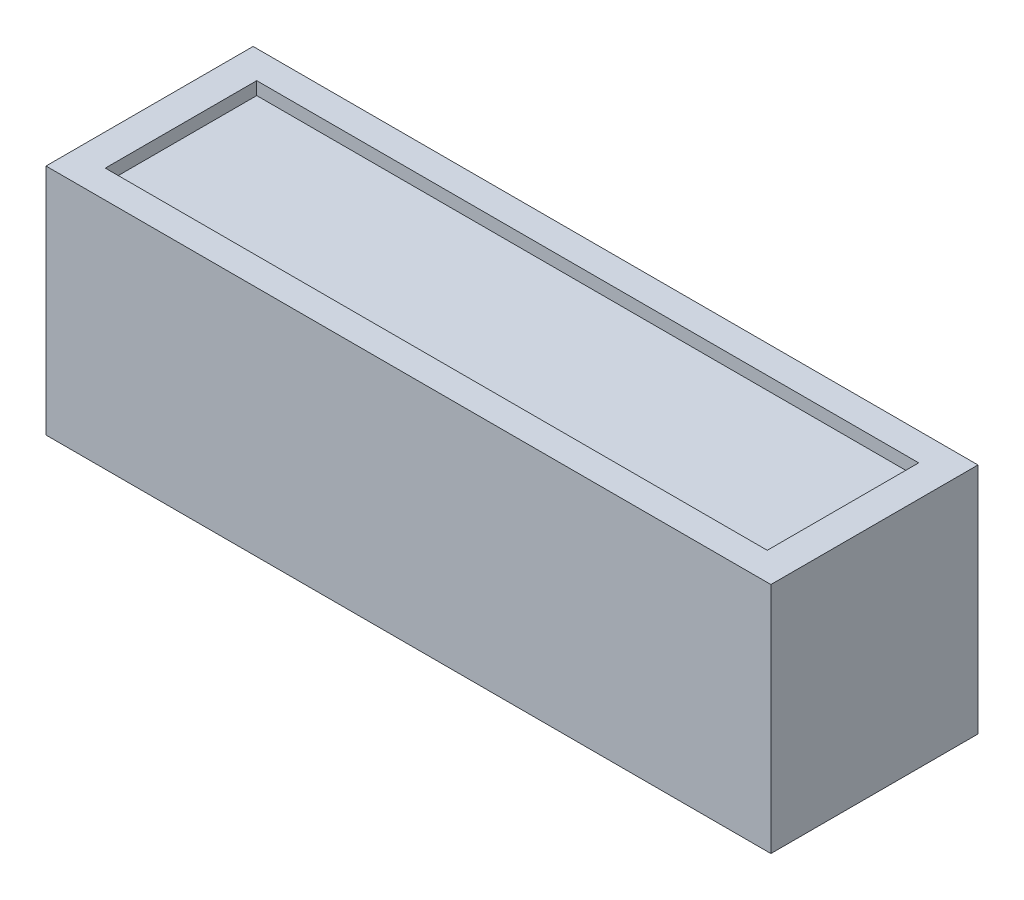
ISO-10303-21;
HEADER;
FILE_DESCRIPTION(('STEP AP214'),'2;1');
FILE_NAME('part.step','',(''),(''),'','','');
FILE_SCHEMA(('AUTOMOTIVE_DESIGN { 1 0 10303 214 1 1 1 1 }'));
ENDSEC;
DATA;
#1=APPLICATION_CONTEXT('core data for automotive mechanical design processes');
#2=APPLICATION_PROTOCOL_DEFINITION('international standard','automotive_design',2000,#1);
#3=PRODUCT_CONTEXT('',#1,'mechanical');
#4=PRODUCT('Part','Part','',(#3));
#5=PRODUCT_RELATED_PRODUCT_CATEGORY('part','',(#4));
#6=PRODUCT_DEFINITION_FORMATION('','',#4);
#7=PRODUCT_DEFINITION_CONTEXT('part definition',#1,'design');
#8=PRODUCT_DEFINITION('design','',#6,#7);
#9=PRODUCT_DEFINITION_SHAPE('','',#8);
#10=(LENGTH_UNIT() NAMED_UNIT(*) SI_UNIT(.MILLI.,.METRE.));
#11=(NAMED_UNIT(*) PLANE_ANGLE_UNIT() SI_UNIT($,.RADIAN.));
#12=(NAMED_UNIT(*) SI_UNIT($,.STERADIAN.) SOLID_ANGLE_UNIT());
#13=UNCERTAINTY_MEASURE_WITH_UNIT(LENGTH_MEASURE(1.E-05),#10,'distance_accuracy_value','');
#14=(GEOMETRIC_REPRESENTATION_CONTEXT(3) GLOBAL_UNCERTAINTY_ASSIGNED_CONTEXT((#13)) GLOBAL_UNIT_ASSIGNED_CONTEXT((#10,
#11,#12)) REPRESENTATION_CONTEXT('',''));
#15=CARTESIAN_POINT('',(0.,0.,0.));
#16=DIRECTION('',(0.,0.,1.));
#17=DIRECTION('',(1.,0.,0.));
#18=AXIS2_PLACEMENT_3D('',#15,#16,#17);
#19=CARTESIAN_POINT('',(0.,0.,8.));
#20=DIRECTION('',(1.,0.,0.));
#21=DIRECTION('',(0.,0.,-1.));
#22=AXIS2_PLACEMENT_3D('',#19,#20,#21);
#23=PLANE('',#22);
#24=DIRECTION('',(0.,-1.,0.));
#25=VECTOR('',#24,1.);
#26=CARTESIAN_POINT('',(0.,0.,0.));
#27=LINE('',#26,#25);
#28=CARTESIAN_POINT('',(0.,9.,0.));
#29=VERTEX_POINT('',#28);
#30=CARTESIAN_POINT('',(0.,0.,0.));
#31=VERTEX_POINT('',#30);
#32=EDGE_CURVE('E143',#29,#31,#27,.T.);
#33=ORIENTED_EDGE('',*,*,#32,.T.);
#34=DIRECTION('',(0.,0.,-1.));
#35=VECTOR('',#34,1.);
#36=CARTESIAN_POINT('',(0.,0.,8.));
#37=LINE('',#36,#35);
#38=CARTESIAN_POINT('',(0.,0.,8.));
#39=VERTEX_POINT('',#38);
#40=EDGE_CURVE('E11',#39,#31,#37,.T.);
#41=ORIENTED_EDGE('',*,*,#40,.F.);
#42=DIRECTION('',(0.,-1.,0.));
#43=VECTOR('',#42,1.);
#44=CARTESIAN_POINT('',(0.,0.,8.));
#45=LINE('',#44,#43);
#46=CARTESIAN_POINT('',(0.,9.,8.));
#47=VERTEX_POINT('',#46);
#48=EDGE_CURVE('E147',#47,#39,#45,.T.);
#49=ORIENTED_EDGE('',*,*,#48,.F.);
#50=DIRECTION('',(0.,0.,-1.));
#51=VECTOR('',#50,1.);
#52=CARTESIAN_POINT('',(0.,9.,8.));
#53=LINE('',#52,#51);
#54=EDGE_CURVE('E153',#47,#29,#53,.T.);
#55=ORIENTED_EDGE('',*,*,#54,.T.);
#56=EDGE_LOOP('',(#33,#41,#49,#55));
#57=FACE_BOUND('',#56,.T.);
#58=ADVANCED_FACE('F33',(#57),#23,.F.);
#59=CARTESIAN_POINT('',(0.,0.,8.));
#60=DIRECTION('',(0.,1.,0.));
#61=DIRECTION('',(0.,0.,1.));
#62=AXIS2_PLACEMENT_3D('',#59,#60,#61);
#63=PLANE('',#62);
#64=DIRECTION('',(1.,0.,0.));
#65=VECTOR('',#64,1.);
#66=CARTESIAN_POINT('',(0.,0.,0.));
#67=LINE('',#66,#65);
#68=CARTESIAN_POINT('',(28.,0.,0.));
#69=VERTEX_POINT('',#68);
#70=EDGE_CURVE('E156',#31,#69,#67,.T.);
#71=ORIENTED_EDGE('',*,*,#70,.T.);
#72=DIRECTION('',(0.,0.,-1.));
#73=VECTOR('',#72,1.);
#74=CARTESIAN_POINT('',(28.,0.,8.));
#75=LINE('',#74,#73);
#76=CARTESIAN_POINT('',(28.,0.,8.));
#77=VERTEX_POINT('',#76);
#78=EDGE_CURVE('E40',#77,#69,#75,.T.);
#79=ORIENTED_EDGE('',*,*,#78,.F.);
#80=DIRECTION('',(1.,0.,0.));
#81=VECTOR('',#80,1.);
#82=CARTESIAN_POINT('',(0.,0.,8.));
#83=LINE('',#82,#81);
#84=EDGE_CURVE('E84',#39,#77,#83,.T.);
#85=ORIENTED_EDGE('',*,*,#84,.F.);
#86=ORIENTED_EDGE('',*,*,#40,.T.);
#87=EDGE_LOOP('',(#71,#79,#85,#86));
#88=FACE_BOUND('',#87,.T.);
#89=ADVANCED_FACE('F185',(#88),#63,.F.);
#90=CARTESIAN_POINT('',(28.,0.,8.));
#91=DIRECTION('',(-1.,0.,0.));
#92=DIRECTION('',(0.,-1.,0.));
#93=AXIS2_PLACEMENT_3D('',#90,#91,#92);
#94=PLANE('',#93);
#95=DIRECTION('',(0.,1.,0.));
#96=VECTOR('',#95,1.);
#97=CARTESIAN_POINT('',(28.,0.,0.));
#98=LINE('',#97,#96);
#99=CARTESIAN_POINT('',(28.,9.,0.));
#100=VERTEX_POINT('',#99);
#101=EDGE_CURVE('E158',#69,#100,#98,.T.);
#102=ORIENTED_EDGE('',*,*,#101,.T.);
#103=DIRECTION('',(0.,0.,-1.));
#104=VECTOR('',#103,1.);
#105=CARTESIAN_POINT('',(28.,9.,8.));
#106=LINE('',#105,#104);
#107=CARTESIAN_POINT('',(28.,9.,8.));
#108=VERTEX_POINT('',#107);
#109=EDGE_CURVE('E162',#108,#100,#106,.T.);
#110=ORIENTED_EDGE('',*,*,#109,.F.);
#111=DIRECTION('',(0.,1.,0.));
#112=VECTOR('',#111,1.);
#113=CARTESIAN_POINT('',(28.,0.,8.));
#114=LINE('',#113,#112);
#115=EDGE_CURVE('E150',#77,#108,#114,.T.);
#116=ORIENTED_EDGE('',*,*,#115,.F.);
#117=ORIENTED_EDGE('',*,*,#78,.T.);
#118=EDGE_LOOP('',(#102,#110,#116,#117));
#119=FACE_BOUND('',#118,.T.);
#120=ADVANCED_FACE('F167',(#119),#94,.F.);
#121=CARTESIAN_POINT('',(0.,9.,8.));
#122=DIRECTION('',(0.,-1.,0.));
#123=DIRECTION('',(0.,0.,-1.));
#124=AXIS2_PLACEMENT_3D('',#121,#122,#123);
#125=PLANE('',#124);
#126=DIRECTION('',(-1.,0.,0.));
#127=VECTOR('',#126,1.);
#128=CARTESIAN_POINT('',(14.,9.,1.07489900046096));
#129=LINE('',#128,#127);
#130=CARTESIAN_POINT('',(26.7847086790199,9.,1.07489900046096));
#131=VERTEX_POINT('',#130);
#132=CARTESIAN_POINT('',(1.21529132098011,9.,1.07489900046096));
#133=VERTEX_POINT('',#132);
#134=EDGE_CURVE('E121',#131,#133,#129,.T.);
#135=ORIENTED_EDGE('',*,*,#134,.F.);
#136=DIRECTION('',(0.,0.,-1.));
#137=VECTOR('',#136,1.);
#138=CARTESIAN_POINT('',(26.7847086790199,9.,6.92510099953904));
#139=LINE('',#138,#137);
#140=CARTESIAN_POINT('',(26.7847086790199,9.,6.92510099953904));
#141=VERTEX_POINT('',#140);
#142=EDGE_CURVE('E47',#141,#131,#139,.T.);
#143=ORIENTED_EDGE('',*,*,#142,.F.);
#144=DIRECTION('',(1.,0.,0.));
#145=VECTOR('',#144,1.);
#146=CARTESIAN_POINT('',(1.21529132098011,9.,6.92510099953904));
#147=LINE('',#146,#145);
#148=CARTESIAN_POINT('',(1.21529132098011,9.,6.92510099953904));
#149=VERTEX_POINT('',#148);
#150=EDGE_CURVE('E137',#149,#141,#147,.T.);
#151=ORIENTED_EDGE('',*,*,#150,.F.);
#152=DIRECTION('',(0.,0.,1.));
#153=VECTOR('',#152,1.);
#154=CARTESIAN_POINT('',(1.21529132098011,9.,4.));
#155=LINE('',#154,#153);
#156=EDGE_CURVE('E135',#133,#149,#155,.T.);
#157=ORIENTED_EDGE('',*,*,#156,.F.);
#158=EDGE_LOOP('',(#135,#143,#151,#157));
#159=FACE_BOUND('',#158,.T.);
#160=DIRECTION('',(-1.,0.,0.));
#161=VECTOR('',#160,1.);
#162=CARTESIAN_POINT('',(0.,9.,0.));
#163=LINE('',#162,#161);
#164=EDGE_CURVE('E77',#100,#29,#163,.T.);
#165=ORIENTED_EDGE('',*,*,#164,.T.);
#166=ORIENTED_EDGE('',*,*,#54,.F.);
#167=DIRECTION('',(-1.,0.,0.));
#168=VECTOR('',#167,1.);
#169=CARTESIAN_POINT('',(0.,9.,8.));
#170=LINE('',#169,#168);
#171=EDGE_CURVE('E56',#108,#47,#170,.T.);
#172=ORIENTED_EDGE('',*,*,#171,.F.);
#173=ORIENTED_EDGE('',*,*,#109,.T.);
#174=EDGE_LOOP('',(#165,#166,#172,#173));
#175=FACE_BOUND('',#174,.T.);
#176=ADVANCED_FACE('F175',(#159,#175),#125,.F.);
#177=CARTESIAN_POINT('',(0.,9.,8.));
#178=DIRECTION('',(0.,0.,-1.));
#179=DIRECTION('',(-1.,0.,0.));
#180=AXIS2_PLACEMENT_3D('',#177,#178,#179);
#181=PLANE('',#180);
#182=ORIENTED_EDGE('',*,*,#48,.T.);
#183=ORIENTED_EDGE('',*,*,#84,.T.);
#184=ORIENTED_EDGE('',*,*,#115,.T.);
#185=ORIENTED_EDGE('',*,*,#171,.T.);
#186=EDGE_LOOP('',(#182,#183,#184,#185));
#187=FACE_BOUND('',#186,.T.);
#188=ADVANCED_FACE('F177',(#187),#181,.F.);
#189=CARTESIAN_POINT('',(0.,9.,0.));
#190=DIRECTION('',(0.,0.,-1.));
#191=DIRECTION('',(-1.,0.,0.));
#192=AXIS2_PLACEMENT_3D('',#189,#190,#191);
#193=PLANE('',#192);
#194=ORIENTED_EDGE('',*,*,#32,.F.);
#195=ORIENTED_EDGE('',*,*,#164,.F.);
#196=ORIENTED_EDGE('',*,*,#101,.F.);
#197=ORIENTED_EDGE('',*,*,#70,.F.);
#198=EDGE_LOOP('',(#194,#195,#196,#197));
#199=FACE_BOUND('',#198,.T.);
#200=ADVANCED_FACE('F171',(#199),#193,.T.);
#201=CARTESIAN_POINT('',(26.7847086790199,8.5,6.92510099953904));
#202=DIRECTION('',(1.,0.,0.));
#203=DIRECTION('',(0.,0.,-1.));
#204=AXIS2_PLACEMENT_3D('',#201,#202,#203);
#205=PLANE('',#204);
#206=ORIENTED_EDGE('',*,*,#142,.T.);
#207=DIRECTION('',(0.,1.,0.));
#208=VECTOR('',#207,1.);
#209=CARTESIAN_POINT('',(26.7847086790199,8.5,1.07489900046096));
#210=LINE('',#209,#208);
#211=CARTESIAN_POINT('',(26.7847086790199,8.5,1.07489900046096));
#212=VERTEX_POINT('',#211);
#213=EDGE_CURVE('E141',#212,#131,#210,.T.);
#214=ORIENTED_EDGE('',*,*,#213,.F.);
#215=DIRECTION('',(0.,0.,-1.));
#216=VECTOR('',#215,1.);
#217=CARTESIAN_POINT('',(26.7847086790199,8.5,6.92510099953904));
#218=LINE('',#217,#216);
#219=CARTESIAN_POINT('',(26.7847086790199,8.5,6.92510099953904));
#220=VERTEX_POINT('',#219);
#221=EDGE_CURVE('E114',#220,#212,#218,.T.);
#222=ORIENTED_EDGE('',*,*,#221,.F.);
#223=DIRECTION('',(0.,1.,0.));
#224=VECTOR('',#223,1.);
#225=CARTESIAN_POINT('',(26.7847086790199,8.5,6.92510099953904));
#226=LINE('',#225,#224);
#227=EDGE_CURVE('E144',#220,#141,#226,.T.);
#228=ORIENTED_EDGE('',*,*,#227,.T.);
#229=EDGE_LOOP('',(#206,#214,#222,#228));
#230=FACE_BOUND('',#229,.T.);
#231=ADVANCED_FACE('F213',(#230),#205,.F.);
#232=CARTESIAN_POINT('',(1.21529132098011,8.5,6.92510099953904));
#233=DIRECTION('',(0.,0.,1.));
#234=DIRECTION('',(1.,0.,0.));
#235=AXIS2_PLACEMENT_3D('',#232,#233,#234);
#236=PLANE('',#235);
#237=ORIENTED_EDGE('',*,*,#150,.T.);
#238=ORIENTED_EDGE('',*,*,#227,.F.);
#239=DIRECTION('',(1.,0.,0.));
#240=VECTOR('',#239,1.);
#241=CARTESIAN_POINT('',(1.21529132098011,8.5,6.92510099953904));
#242=LINE('',#241,#240);
#243=CARTESIAN_POINT('',(1.21529132098011,8.5,6.92510099953904));
#244=VERTEX_POINT('',#243);
#245=EDGE_CURVE('E129',#244,#220,#242,.T.);
#246=ORIENTED_EDGE('',*,*,#245,.F.);
#247=DIRECTION('',(0.,1.,0.));
#248=VECTOR('',#247,1.);
#249=CARTESIAN_POINT('',(1.21529132098011,8.5,6.92510099953904));
#250=LINE('',#249,#248);
#251=EDGE_CURVE('E125',#244,#149,#250,.T.);
#252=ORIENTED_EDGE('',*,*,#251,.T.);
#253=EDGE_LOOP('',(#237,#238,#246,#252));
#254=FACE_BOUND('',#253,.T.);
#255=ADVANCED_FACE('F225',(#254),#236,.F.);
#256=CARTESIAN_POINT('',(1.21529132098011,8.5,4.));
#257=DIRECTION('',(-1.,0.,0.));
#258=DIRECTION('',(0.,0.,1.));
#259=AXIS2_PLACEMENT_3D('',#256,#257,#258);
#260=PLANE('',#259);
#261=ORIENTED_EDGE('',*,*,#156,.T.);
#262=ORIENTED_EDGE('',*,*,#251,.F.);
#263=DIRECTION('',(0.,0.,1.));
#264=VECTOR('',#263,1.);
#265=CARTESIAN_POINT('',(1.21529132098011,8.5,1.07489900046096));
#266=LINE('',#265,#264);
#267=CARTESIAN_POINT('',(1.21529132098011,8.5,1.07489900046096));
#268=VERTEX_POINT('',#267);
#269=EDGE_CURVE('E111',#268,#244,#266,.T.);
#270=ORIENTED_EDGE('',*,*,#269,.F.);
#271=DIRECTION('',(0.,1.,0.));
#272=VECTOR('',#271,1.);
#273=CARTESIAN_POINT('',(1.21529132098011,8.5,1.07489900046096));
#274=LINE('',#273,#272);
#275=EDGE_CURVE('E118',#268,#133,#274,.T.);
#276=ORIENTED_EDGE('',*,*,#275,.T.);
#277=EDGE_LOOP('',(#261,#262,#270,#276));
#278=FACE_BOUND('',#277,.T.);
#279=ADVANCED_FACE('F127',(#278),#260,.F.);
#280=CARTESIAN_POINT('',(14.,8.5,1.07489900046096));
#281=DIRECTION('',(0.,0.,-1.));
#282=DIRECTION('',(-1.,0.,0.));
#283=AXIS2_PLACEMENT_3D('',#280,#281,#282);
#284=PLANE('',#283);
#285=ORIENTED_EDGE('',*,*,#134,.T.);
#286=ORIENTED_EDGE('',*,*,#275,.F.);
#287=DIRECTION('',(-1.,0.,0.));
#288=VECTOR('',#287,1.);
#289=CARTESIAN_POINT('',(26.7847086790199,8.5,1.07489900046096));
#290=LINE('',#289,#288);
#291=EDGE_CURVE('E106',#212,#268,#290,.T.);
#292=ORIENTED_EDGE('',*,*,#291,.F.);
#293=ORIENTED_EDGE('',*,*,#213,.T.);
#294=EDGE_LOOP('',(#285,#286,#292,#293));
#295=FACE_BOUND('',#294,.T.);
#296=ADVANCED_FACE('F119',(#295),#284,.F.);
#297=CARTESIAN_POINT('',(1.21529132098011,8.5,1.07489900046096));
#298=DIRECTION('',(0.,1.,0.));
#299=DIRECTION('',(0.,0.,1.));
#300=AXIS2_PLACEMENT_3D('',#297,#298,#299);
#301=PLANE('',#300);
#302=ORIENTED_EDGE('',*,*,#291,.T.);
#303=ORIENTED_EDGE('',*,*,#269,.T.);
#304=ORIENTED_EDGE('',*,*,#245,.T.);
#305=ORIENTED_EDGE('',*,*,#221,.T.);
#306=EDGE_LOOP('',(#302,#303,#304,#305));
#307=FACE_BOUND('',#306,.T.);
#308=ADVANCED_FACE('F108',(#307),#301,.T.);
#309=CLOSED_SHELL('',(#58,#89,#120,#176,#188,#200,#231,#255,#279,#296,#308));
#310=MANIFOLD_SOLID_BREP('B2',#309);
#311=ADVANCED_BREP_SHAPE_REPRESENTATION('',(#18,#310),#14);
#312=SHAPE_DEFINITION_REPRESENTATION(#9,#311);
ENDSEC;
END-ISO-10303-21;
